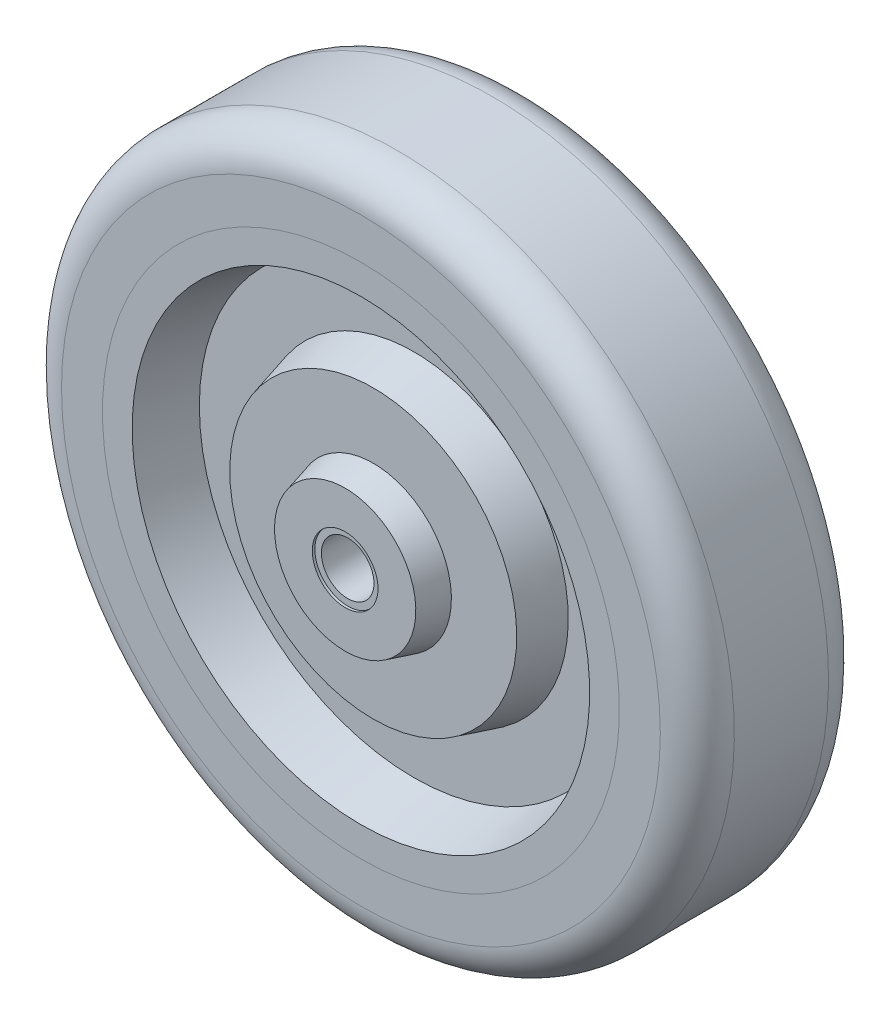
ISO-10303-21;
HEADER;
FILE_DESCRIPTION(('STEP AP214'),'2;1');
FILE_NAME('part.step','',(''),(''),'','','');
FILE_SCHEMA(('AUTOMOTIVE_DESIGN { 1 0 10303 214 1 1 1 1 }'));
ENDSEC;
DATA;
#1=APPLICATION_CONTEXT('core data for automotive mechanical design processes');
#2=APPLICATION_PROTOCOL_DEFINITION('international standard','automotive_design',2000,#1);
#3=PRODUCT_CONTEXT('',#1,'mechanical');
#4=PRODUCT('Part','Part','',(#3));
#5=PRODUCT_RELATED_PRODUCT_CATEGORY('part','',(#4));
#6=PRODUCT_DEFINITION_FORMATION('','',#4);
#7=PRODUCT_DEFINITION_CONTEXT('part definition',#1,'design');
#8=PRODUCT_DEFINITION('design','',#6,#7);
#9=PRODUCT_DEFINITION_SHAPE('','',#8);
#10=(LENGTH_UNIT() NAMED_UNIT(*) SI_UNIT(.MILLI.,.METRE.));
#11=(NAMED_UNIT(*) PLANE_ANGLE_UNIT() SI_UNIT($,.RADIAN.));
#12=(NAMED_UNIT(*) SI_UNIT($,.STERADIAN.) SOLID_ANGLE_UNIT());
#13=UNCERTAINTY_MEASURE_WITH_UNIT(LENGTH_MEASURE(1.E-05),#10,'distance_accuracy_value','');
#14=(GEOMETRIC_REPRESENTATION_CONTEXT(3) GLOBAL_UNCERTAINTY_ASSIGNED_CONTEXT((#13)) GLOBAL_UNIT_ASSIGNED_CONTEXT((#10,
#11,#12)) REPRESENTATION_CONTEXT('',''));
#15=CARTESIAN_POINT('',(0.,0.,0.));
#16=DIRECTION('',(0.,0.,1.));
#17=DIRECTION('',(1.,0.,0.));
#18=AXIS2_PLACEMENT_3D('',#15,#16,#17);
#19=CARTESIAN_POINT('',(0.,0.,15.08125));
#20=DIRECTION('',(0.,0.,1.));
#21=DIRECTION('',(0.,-1.,0.));
#22=AXIS2_PLACEMENT_3D('',#19,#20,#21);
#23=CYLINDRICAL_SURFACE('',#22,3.96875);
#24=CARTESIAN_POINT('',(0.,0.,14.70025));
#25=DIRECTION('',(0.,0.,1.));
#26=DIRECTION('',(1.,0.,0.));
#27=AXIS2_PLACEMENT_3D('',#24,#25,#26);
#28=CIRCLE('',#27,3.96875);
#29=CARTESIAN_POINT('',(3.96875,0.,14.70025));
#30=VERTEX_POINT('',#29);
#31=EDGE_CURVE('E61',#30,#30,#28,.F.);
#32=ORIENTED_EDGE('',*,*,#31,.F.);
#33=EDGE_LOOP('',(#32));
#34=FACE_BOUND('',#33,.T.);
#35=CARTESIAN_POINT('',(0.,0.,-14.70025));
#36=DIRECTION('',(0.,0.,-1.));
#37=DIRECTION('',(-1.,0.,0.));
#38=AXIS2_PLACEMENT_3D('',#35,#36,#37);
#39=CIRCLE('',#38,3.96875);
#40=CARTESIAN_POINT('',(-3.96875,0.,-14.70025));
#41=VERTEX_POINT('',#40);
#42=EDGE_CURVE('E49',#41,#41,#39,.F.);
#43=ORIENTED_EDGE('',*,*,#42,.F.);
#44=EDGE_LOOP('',(#43));
#45=FACE_BOUND('',#44,.T.);
#46=ADVANCED_FACE('F45',(#34,#45),#23,.F.);
#47=CARTESIAN_POINT('',(0.,39.0271,12.7));
#48=DIRECTION('',(0.,0.,-1.));
#49=DIRECTION('',(0.,1.,0.));
#50=AXIS2_PLACEMENT_3D('',#47,#48,#49);
#51=PLANE('',#50);
#52=CARTESIAN_POINT('',(0.,0.,12.7));
#53=DIRECTION('',(0.,0.,1.));
#54=DIRECTION('',(0.,-1.,0.));
#55=AXIS2_PLACEMENT_3D('',#52,#53,#54);
#56=CIRCLE('',#55,34.544);
#57=CARTESIAN_POINT('',(0.,-34.544,12.7));
#58=VERTEX_POINT('',#57);
#59=EDGE_CURVE('E63',#58,#58,#56,.T.);
#60=ORIENTED_EDGE('',*,*,#59,.F.);
#61=EDGE_LOOP('',(#60));
#62=FACE_BOUND('',#61,.T.);
#63=CARTESIAN_POINT('',(0.,0.,12.7));
#64=DIRECTION('',(0.,0.,1.));
#65=DIRECTION('',(0.,-1.,0.));
#66=AXIS2_PLACEMENT_3D('',#63,#64,#65);
#67=CIRCLE('',#66,39.0271);
#68=CARTESIAN_POINT('',(0.,-39.0271,12.7));
#69=VERTEX_POINT('',#68);
#70=EDGE_CURVE('E11',#69,#69,#67,.T.);
#71=ORIENTED_EDGE('',*,*,#70,.T.);
#72=EDGE_LOOP('',(#71));
#73=FACE_BOUND('',#72,.T.);
#74=ADVANCED_FACE('F47',(#62,#73),#51,.F.);
#75=CARTESIAN_POINT('',(0.,0.,15.08125));
#76=DIRECTION('',(0.,0.,1.));
#77=DIRECTION('',(0.,-1.,0.));
#78=AXIS2_PLACEMENT_3D('',#75,#76,#77);
#79=CYLINDRICAL_SURFACE('',#78,39.0271);
#80=ORIENTED_EDGE('',*,*,#70,.F.);
#81=EDGE_LOOP('',(#80));
#82=FACE_BOUND('',#81,.T.);
#83=CARTESIAN_POINT('',(0.,0.,-12.7));
#84=DIRECTION('',(0.,0.,1.));
#85=DIRECTION('',(0.,-1.,0.));
#86=AXIS2_PLACEMENT_3D('',#83,#84,#85);
#87=CIRCLE('',#86,39.0271);
#88=CARTESIAN_POINT('',(0.,-39.0271,-12.7));
#89=VERTEX_POINT('',#88);
#90=EDGE_CURVE('E53',#89,#89,#87,.T.);
#91=ORIENTED_EDGE('',*,*,#90,.T.);
#92=EDGE_LOOP('',(#91));
#93=FACE_BOUND('',#92,.T.);
#94=ADVANCED_FACE('F164',(#82,#93),#79,.T.);
#95=CARTESIAN_POINT('',(0.,39.0271,-12.7));
#96=DIRECTION('',(0.,0.,1.));
#97=DIRECTION('',(0.,-1.,0.));
#98=AXIS2_PLACEMENT_3D('',#95,#96,#97);
#99=PLANE('',#98);
#100=ORIENTED_EDGE('',*,*,#90,.F.);
#101=EDGE_LOOP('',(#100));
#102=FACE_BOUND('',#101,.T.);
#103=CARTESIAN_POINT('',(0.,0.,-12.7));
#104=DIRECTION('',(0.,0.,1.));
#105=DIRECTION('',(0.,-1.,0.));
#106=AXIS2_PLACEMENT_3D('',#103,#104,#105);
#107=CIRCLE('',#106,34.544);
#108=CARTESIAN_POINT('',(0.,-34.544,-12.7));
#109=VERTEX_POINT('',#108);
#110=EDGE_CURVE('E58',#109,#109,#107,.T.);
#111=ORIENTED_EDGE('',*,*,#110,.T.);
#112=EDGE_LOOP('',(#111));
#113=FACE_BOUND('',#112,.T.);
#114=ADVANCED_FACE('F112',(#102,#113),#99,.F.);
#115=CARTESIAN_POINT('',(0.,0.,-4.699));
#116=DIRECTION('',(0.,0.,-1.));
#117=DIRECTION('',(0.,1.,0.));
#118=AXIS2_PLACEMENT_3D('',#115,#116,#117);
#119=CONICAL_SURFACE('',#118,32.4001385113586,0.261799387799143);
#120=ORIENTED_EDGE('',*,*,#110,.F.);
#121=EDGE_LOOP('',(#120));
#122=FACE_BOUND('',#121,.T.);
#123=CARTESIAN_POINT('',(0.,0.,-4.699));
#124=DIRECTION('',(0.,0.,1.));
#125=DIRECTION('',(0.,-1.,0.));
#126=AXIS2_PLACEMENT_3D('',#123,#124,#125);
#127=CIRCLE('',#126,32.4001385113586);
#128=CARTESIAN_POINT('',(0.,-32.4001385113586,-4.69900000000001));
#129=VERTEX_POINT('',#128);
#130=EDGE_CURVE('E107',#129,#129,#127,.T.);
#131=ORIENTED_EDGE('',*,*,#130,.T.);
#132=EDGE_LOOP('',(#131));
#133=FACE_BOUND('',#132,.T.);
#134=ADVANCED_FACE('F114',(#122,#133),#119,.F.);
#135=CARTESIAN_POINT('',(0.,32.4001385113586,-4.699));
#136=DIRECTION('',(0.,0.,1.));
#137=DIRECTION('',(0.,-1.,0.));
#138=AXIS2_PLACEMENT_3D('',#135,#136,#137);
#139=PLANE('',#138);
#140=ORIENTED_EDGE('',*,*,#130,.F.);
#141=EDGE_LOOP('',(#140));
#142=FACE_BOUND('',#141,.T.);
#143=CARTESIAN_POINT('',(0.,0.,-4.699));
#144=DIRECTION('',(0.,0.,1.));
#145=DIRECTION('',(0.,-1.,0.));
#146=AXIS2_PLACEMENT_3D('',#143,#144,#145);
#147=CIRCLE('',#146,23.3115286186636);
#148=CARTESIAN_POINT('',(0.,-23.3115286186636,-4.69900000000001));
#149=VERTEX_POINT('',#148);
#150=EDGE_CURVE('E104',#149,#149,#147,.T.);
#151=ORIENTED_EDGE('',*,*,#150,.T.);
#152=EDGE_LOOP('',(#151));
#153=FACE_BOUND('',#152,.T.);
#154=ADVANCED_FACE('F117',(#142,#153),#139,.F.);
#155=CARTESIAN_POINT('',(0.,0.,-10.83945));
#156=DIRECTION('',(0.,0.,1.));
#157=DIRECTION('',(0.,-1.,0.));
#158=AXIS2_PLACEMENT_3D('',#155,#156,#157);
#159=CONICAL_SURFACE('',#158,21.6662,0.261799387799143);
#160=ORIENTED_EDGE('',*,*,#150,.F.);
#161=EDGE_LOOP('',(#160));
#162=FACE_BOUND('',#161,.T.);
#163=CARTESIAN_POINT('',(0.,0.,-10.83945));
#164=DIRECTION('',(0.,0.,1.));
#165=DIRECTION('',(0.,-1.,0.));
#166=AXIS2_PLACEMENT_3D('',#163,#164,#165);
#167=CIRCLE('',#166,21.6662);
#168=CARTESIAN_POINT('',(0.,-21.6662,-10.83945));
#169=VERTEX_POINT('',#168);
#170=EDGE_CURVE('E101',#169,#169,#167,.T.);
#171=ORIENTED_EDGE('',*,*,#170,.T.);
#172=EDGE_LOOP('',(#171));
#173=FACE_BOUND('',#172,.T.);
#174=ADVANCED_FACE('F123',(#162,#173),#159,.T.);
#175=CARTESIAN_POINT('',(0.,21.6662,-10.83945));
#176=DIRECTION('',(0.,0.,1.));
#177=DIRECTION('',(0.,-1.,0.));
#178=AXIS2_PLACEMENT_3D('',#175,#176,#177);
#179=PLANE('',#178);
#180=ORIENTED_EDGE('',*,*,#170,.F.);
#181=EDGE_LOOP('',(#180));
#182=FACE_BOUND('',#181,.T.);
#183=CARTESIAN_POINT('',(0.,0.,-10.83945));
#184=DIRECTION('',(0.,0.,1.));
#185=DIRECTION('',(0.,-1.,0.));
#186=AXIS2_PLACEMENT_3D('',#183,#184,#185);
#187=CIRCLE('',#186,11.8045868844543);
#188=CARTESIAN_POINT('',(0.,-11.8045868844543,-10.83945));
#189=VERTEX_POINT('',#188);
#190=EDGE_CURVE('E98',#189,#189,#187,.T.);
#191=ORIENTED_EDGE('',*,*,#190,.T.);
#192=EDGE_LOOP('',(#191));
#193=FACE_BOUND('',#192,.T.);
#194=ADVANCED_FACE('F129',(#182,#193),#179,.F.);
#195=CARTESIAN_POINT('',(0.,0.,-15.08125));
#196=DIRECTION('',(0.,0.,1.));
#197=DIRECTION('',(0.,-1.,0.));
#198=AXIS2_PLACEMENT_3D('',#195,#196,#197);
#199=CONICAL_SURFACE('',#198,10.668,0.261799387799143);
#200=ORIENTED_EDGE('',*,*,#190,.F.);
#201=EDGE_LOOP('',(#200));
#202=FACE_BOUND('',#201,.T.);
#203=CARTESIAN_POINT('',(0.,0.,-15.08125));
#204=DIRECTION('',(0.,0.,1.));
#205=DIRECTION('',(0.,-1.,0.));
#206=AXIS2_PLACEMENT_3D('',#203,#204,#205);
#207=CIRCLE('',#206,10.668);
#208=CARTESIAN_POINT('',(0.,-10.668,-15.08125));
#209=VERTEX_POINT('',#208);
#210=EDGE_CURVE('E95',#209,#209,#207,.T.);
#211=ORIENTED_EDGE('',*,*,#210,.T.);
#212=EDGE_LOOP('',(#211));
#213=FACE_BOUND('',#212,.T.);
#214=ADVANCED_FACE('F135',(#202,#213),#199,.T.);
#215=CARTESIAN_POINT('',(0.,10.668,-15.08125));
#216=DIRECTION('',(0.,0.,1.));
#217=DIRECTION('',(0.,-1.,0.));
#218=AXIS2_PLACEMENT_3D('',#215,#216,#217);
#219=PLANE('',#218);
#220=CARTESIAN_POINT('',(0.,0.,-15.08125));
#221=DIRECTION('',(0.,0.,1.));
#222=DIRECTION('',(1.,0.,0.));
#223=AXIS2_PLACEMENT_3D('',#220,#221,#222);
#224=CIRCLE('',#223,4.9609375);
#225=CARTESIAN_POINT('',(-4.9609375,0.,-15.08125));
#226=VERTEX_POINT('',#225);
#227=EDGE_CURVE('E78',#226,#226,#224,.T.);
#228=ORIENTED_EDGE('',*,*,#227,.T.);
#229=EDGE_LOOP('',(#228));
#230=FACE_BOUND('',#229,.T.);
#231=ORIENTED_EDGE('',*,*,#210,.F.);
#232=EDGE_LOOP('',(#231));
#233=FACE_BOUND('',#232,.T.);
#234=ADVANCED_FACE('F141',(#230,#233),#219,.F.);
#235=CARTESIAN_POINT('',(0.,10.668,15.08125));
#236=DIRECTION('',(0.,0.,-1.));
#237=DIRECTION('',(0.,1.,0.));
#238=AXIS2_PLACEMENT_3D('',#235,#236,#237);
#239=PLANE('',#238);
#240=CARTESIAN_POINT('',(0.,0.,15.08125));
#241=DIRECTION('',(0.,0.,1.));
#242=DIRECTION('',(1.,0.,0.));
#243=AXIS2_PLACEMENT_3D('',#240,#241,#242);
#244=CIRCLE('',#243,4.9609375);
#245=CARTESIAN_POINT('',(4.9609375,0.,15.08125));
#246=VERTEX_POINT('',#245);
#247=EDGE_CURVE('E71',#246,#246,#244,.T.);
#248=ORIENTED_EDGE('',*,*,#247,.F.);
#249=EDGE_LOOP('',(#248));
#250=FACE_BOUND('',#249,.T.);
#251=CARTESIAN_POINT('',(0.,0.,15.08125));
#252=DIRECTION('',(0.,0.,1.));
#253=DIRECTION('',(0.,-1.,0.));
#254=AXIS2_PLACEMENT_3D('',#251,#252,#253);
#255=CIRCLE('',#254,10.668);
#256=CARTESIAN_POINT('',(0.,-10.668,15.08125));
#257=VERTEX_POINT('',#256);
#258=EDGE_CURVE('E92',#257,#257,#255,.T.);
#259=ORIENTED_EDGE('',*,*,#258,.T.);
#260=EDGE_LOOP('',(#259));
#261=FACE_BOUND('',#260,.T.);
#262=ADVANCED_FACE('F146',(#250,#261),#239,.F.);
#263=CARTESIAN_POINT('',(0.,0.,10.83945));
#264=DIRECTION('',(0.,0.,-1.));
#265=DIRECTION('',(0.,1.,0.));
#266=AXIS2_PLACEMENT_3D('',#263,#264,#265);
#267=CONICAL_SURFACE('',#266,11.8045868844543,0.261799387799143);
#268=ORIENTED_EDGE('',*,*,#258,.F.);
#269=EDGE_LOOP('',(#268));
#270=FACE_BOUND('',#269,.T.);
#271=CARTESIAN_POINT('',(0.,0.,10.83945));
#272=DIRECTION('',(0.,0.,1.));
#273=DIRECTION('',(0.,-1.,0.));
#274=AXIS2_PLACEMENT_3D('',#271,#272,#273);
#275=CIRCLE('',#274,11.8045868844543);
#276=CARTESIAN_POINT('',(0.,-11.8045868844543,10.83945));
#277=VERTEX_POINT('',#276);
#278=EDGE_CURVE('E89',#277,#277,#275,.T.);
#279=ORIENTED_EDGE('',*,*,#278,.T.);
#280=EDGE_LOOP('',(#279));
#281=FACE_BOUND('',#280,.T.);
#282=ADVANCED_FACE('F154',(#270,#281),#267,.T.);
#283=CARTESIAN_POINT('',(0.,21.6662,10.83945));
#284=DIRECTION('',(0.,0.,-1.));
#285=DIRECTION('',(0.,1.,0.));
#286=AXIS2_PLACEMENT_3D('',#283,#284,#285);
#287=PLANE('',#286);
#288=ORIENTED_EDGE('',*,*,#278,.F.);
#289=EDGE_LOOP('',(#288));
#290=FACE_BOUND('',#289,.T.);
#291=CARTESIAN_POINT('',(0.,0.,10.83945));
#292=DIRECTION('',(0.,0.,1.));
#293=DIRECTION('',(0.,-1.,0.));
#294=AXIS2_PLACEMENT_3D('',#291,#292,#293);
#295=CIRCLE('',#294,21.6662);
#296=CARTESIAN_POINT('',(0.,-21.6662,10.83945));
#297=VERTEX_POINT('',#296);
#298=EDGE_CURVE('E86',#297,#297,#295,.T.);
#299=ORIENTED_EDGE('',*,*,#298,.T.);
#300=EDGE_LOOP('',(#299));
#301=FACE_BOUND('',#300,.T.);
#302=ADVANCED_FACE('F170',(#290,#301),#287,.F.);
#303=CARTESIAN_POINT('',(0.,0.,4.69899999999999));
#304=DIRECTION('',(0.,0.,-1.));
#305=DIRECTION('',(0.,1.,0.));
#306=AXIS2_PLACEMENT_3D('',#303,#304,#305);
#307=CONICAL_SURFACE('',#306,23.3115286186636,0.261799387799142);
#308=ORIENTED_EDGE('',*,*,#298,.F.);
#309=EDGE_LOOP('',(#308));
#310=FACE_BOUND('',#309,.T.);
#311=CARTESIAN_POINT('',(0.,0.,4.69899999999999));
#312=DIRECTION('',(0.,0.,1.));
#313=DIRECTION('',(0.,-1.,0.));
#314=AXIS2_PLACEMENT_3D('',#311,#312,#313);
#315=CIRCLE('',#314,23.3115286186636);
#316=CARTESIAN_POINT('',(0.,-23.3115286186636,4.69899999999999));
#317=VERTEX_POINT('',#316);
#318=EDGE_CURVE('E83',#317,#317,#315,.T.);
#319=ORIENTED_EDGE('',*,*,#318,.T.);
#320=EDGE_LOOP('',(#319));
#321=FACE_BOUND('',#320,.T.);
#322=ADVANCED_FACE('F174',(#310,#321),#307,.T.);
#323=CARTESIAN_POINT('',(0.,32.4001385113586,4.699));
#324=DIRECTION('',(0.,0.,-1.));
#325=DIRECTION('',(0.,1.,0.));
#326=AXIS2_PLACEMENT_3D('',#323,#324,#325);
#327=PLANE('',#326);
#328=ORIENTED_EDGE('',*,*,#318,.F.);
#329=EDGE_LOOP('',(#328));
#330=FACE_BOUND('',#329,.T.);
#331=CARTESIAN_POINT('',(0.,0.,4.69899999999999));
#332=DIRECTION('',(0.,0.,1.));
#333=DIRECTION('',(0.,-1.,0.));
#334=AXIS2_PLACEMENT_3D('',#331,#332,#333);
#335=CIRCLE('',#334,32.4001385113586);
#336=CARTESIAN_POINT('',(0.,-32.4001385113586,4.69899999999999));
#337=VERTEX_POINT('',#336);
#338=EDGE_CURVE('E68',#337,#337,#335,.T.);
#339=ORIENTED_EDGE('',*,*,#338,.T.);
#340=EDGE_LOOP('',(#339));
#341=FACE_BOUND('',#340,.T.);
#342=ADVANCED_FACE('F178',(#330,#341),#327,.F.);
#343=CARTESIAN_POINT('',(0.,0.,12.7));
#344=DIRECTION('',(0.,0.,1.));
#345=DIRECTION('',(0.,-1.,0.));
#346=AXIS2_PLACEMENT_3D('',#343,#344,#345);
#347=CONICAL_SURFACE('',#346,34.544,0.261799387799143);
#348=ORIENTED_EDGE('',*,*,#338,.F.);
#349=EDGE_LOOP('',(#348));
#350=FACE_BOUND('',#349,.T.);
#351=ORIENTED_EDGE('',*,*,#59,.T.);
#352=EDGE_LOOP('',(#351));
#353=FACE_BOUND('',#352,.T.);
#354=ADVANCED_FACE('F182',(#350,#353),#347,.F.);
#355=CARTESIAN_POINT('',(0.,0.,14.70025));
#356=DIRECTION('',(0.,0.,1.));
#357=DIRECTION('',(1.,0.,0.));
#358=AXIS2_PLACEMENT_3D('',#355,#356,#357);
#359=PLANE('',#358);
#360=CARTESIAN_POINT('',(0.,0.,14.70025));
#361=DIRECTION('',(0.,0.,1.));
#362=DIRECTION('',(1.,0.,0.));
#363=AXIS2_PLACEMENT_3D('',#360,#361,#362);
#364=CIRCLE('',#363,4.9609375);
#365=CARTESIAN_POINT('',(4.9609375,0.,14.70025));
#366=VERTEX_POINT('',#365);
#367=EDGE_CURVE('E64',#366,#366,#364,.T.);
#368=ORIENTED_EDGE('',*,*,#367,.T.);
#369=EDGE_LOOP('',(#368));
#370=FACE_BOUND('',#369,.T.);
#371=ORIENTED_EDGE('',*,*,#31,.T.);
#372=EDGE_LOOP('',(#371));
#373=FACE_BOUND('',#372,.T.);
#374=ADVANCED_FACE('F186',(#370,#373),#359,.T.);
#375=CARTESIAN_POINT('',(0.,0.,14.70025));
#376=DIRECTION('',(0.,0.,1.));
#377=DIRECTION('',(1.,0.,0.));
#378=AXIS2_PLACEMENT_3D('',#375,#376,#377);
#379=CYLINDRICAL_SURFACE('',#378,4.9609375);
#380=CARTESIAN_POINT('',(4.9609375,0.,14.70025));
#381=CARTESIAN_POINT('',(4.9609375,0.,14.70421875));
#382=CARTESIAN_POINT('',(4.9609375,0.,14.7081875));
#383=CARTESIAN_POINT('',(4.9609375,0.,14.716125));
#384=CARTESIAN_POINT('',(4.9609375,0.,14.72009375));
#385=CARTESIAN_POINT('',(4.9609375,0.,14.72803125));
#386=CARTESIAN_POINT('',(4.9609375,0.,14.732));
#387=CARTESIAN_POINT('',(4.9609375,0.,14.7399375));
#388=CARTESIAN_POINT('',(4.9609375,0.,14.74390625));
#389=CARTESIAN_POINT('',(4.9609375,0.,14.75184375));
#390=CARTESIAN_POINT('',(4.9609375,0.,14.7558125));
#391=CARTESIAN_POINT('',(4.9609375,0.,14.76375));
#392=CARTESIAN_POINT('',(4.9609375,0.,14.76771875));
#393=CARTESIAN_POINT('',(4.9609375,0.,14.77565625));
#394=CARTESIAN_POINT('',(4.9609375,0.,14.779625));
#395=CARTESIAN_POINT('',(4.9609375,0.,14.7875625));
#396=CARTESIAN_POINT('',(4.9609375,0.,14.79153125));
#397=CARTESIAN_POINT('',(4.9609375,0.,14.79946875));
#398=CARTESIAN_POINT('',(4.9609375,0.,14.8034375));
#399=CARTESIAN_POINT('',(4.9609375,0.,14.811375));
#400=CARTESIAN_POINT('',(4.9609375,0.,14.81534375));
#401=CARTESIAN_POINT('',(4.9609375,0.,14.82328125));
#402=CARTESIAN_POINT('',(4.9609375,0.,14.82725));
#403=CARTESIAN_POINT('',(4.9609375,0.,14.8351875));
#404=CARTESIAN_POINT('',(4.9609375,0.,14.83915625));
#405=CARTESIAN_POINT('',(4.9609375,0.,14.84709375));
#406=CARTESIAN_POINT('',(4.9609375,0.,14.8510625));
#407=CARTESIAN_POINT('',(4.9609375,0.,14.859));
#408=CARTESIAN_POINT('',(4.9609375,0.,14.86296875));
#409=CARTESIAN_POINT('',(4.9609375,0.,14.87090625));
#410=CARTESIAN_POINT('',(4.9609375,0.,14.874875));
#411=CARTESIAN_POINT('',(4.9609375,0.,14.8828125));
#412=CARTESIAN_POINT('',(4.9609375,0.,14.88678125));
#413=CARTESIAN_POINT('',(4.9609375,0.,14.89471875));
#414=CARTESIAN_POINT('',(4.9609375,0.,14.8986875));
#415=CARTESIAN_POINT('',(4.9609375,0.,14.906625));
#416=CARTESIAN_POINT('',(4.9609375,0.,14.91059375));
#417=CARTESIAN_POINT('',(4.9609375,0.,14.91853125));
#418=CARTESIAN_POINT('',(4.9609375,0.,14.9225));
#419=CARTESIAN_POINT('',(4.9609375,0.,14.9304375));
#420=CARTESIAN_POINT('',(4.9609375,0.,14.93440625));
#421=CARTESIAN_POINT('',(4.9609375,0.,14.94234375));
#422=CARTESIAN_POINT('',(4.9609375,0.,14.9463125));
#423=CARTESIAN_POINT('',(4.9609375,0.,14.95425));
#424=CARTESIAN_POINT('',(4.9609375,0.,14.95821875));
#425=CARTESIAN_POINT('',(4.9609375,0.,14.96615625));
#426=CARTESIAN_POINT('',(4.9609375,0.,14.970125));
#427=CARTESIAN_POINT('',(4.9609375,0.,14.9780625));
#428=CARTESIAN_POINT('',(4.9609375,0.,14.98203125));
#429=CARTESIAN_POINT('',(4.9609375,0.,14.98996875));
#430=CARTESIAN_POINT('',(4.9609375,0.,14.9939375));
#431=CARTESIAN_POINT('',(4.9609375,0.,15.001875));
#432=CARTESIAN_POINT('',(4.9609375,0.,15.00584375));
#433=CARTESIAN_POINT('',(4.9609375,0.,15.01378125));
#434=CARTESIAN_POINT('',(4.9609375,0.,15.01775));
#435=CARTESIAN_POINT('',(4.9609375,0.,15.0256875));
#436=CARTESIAN_POINT('',(4.9609375,0.,15.02965625));
#437=CARTESIAN_POINT('',(4.9609375,0.,15.03759375));
#438=CARTESIAN_POINT('',(4.9609375,0.,15.0415625));
#439=CARTESIAN_POINT('',(4.9609375,0.,15.0495));
#440=CARTESIAN_POINT('',(4.9609375,0.,15.05346875));
#441=CARTESIAN_POINT('',(4.9609375,0.,15.06140625));
#442=CARTESIAN_POINT('',(4.9609375,0.,15.065375));
#443=CARTESIAN_POINT('',(4.9609375,0.,15.0733125));
#444=CARTESIAN_POINT('',(4.9609375,0.,15.07728125));
#445=CARTESIAN_POINT('',(4.9609375,0.,15.08125));
#446=B_SPLINE_CURVE_WITH_KNOTS('',3,(#380,#381,#382,#383,#384,#385,#386,#387,#388,#389,#390,
#391,#392,#393,#394,#395,#396,#397,#398,#399,#400,#401,#402,#403,#404,#405,#406,#407,#408,#409,
#410,#411,#412,#413,#414,#415,#416,#417,#418,#419,#420,#421,#422,#423,#424,#425,#426,#427,#428,
#429,#430,#431,#432,#433,#434,#435,#436,#437,#438,#439,#440,#441,#442,#443,#444,#445),
.UNSPECIFIED.,.F.,.F.,(4,2,2,2,2,2,2,2,2,2,2,2,2,2,2,2,2,2,2,2,2,2,2,2,2,2,2,2,2,2,2,2,4),(0.,
0.0119062500000006,0.0238125000000013,0.0357187500000002,0.0476250000000008,0.0595312500000014,
0.0714375000000003,0.083343750000001,0.0952499999999998,0.10715625,0.119062500000001,0.13096875,
0.142875000000001,0.154781250000001,0.1666875,0.178593750000001,0.1905,0.20240625,
0.214312500000001,0.22621875,0.238125,0.250031250000001,0.2619375,0.273843750000001,0.28575,
0.29765625,0.309562500000001,0.32146875,0.333375,0.345281250000001,0.3571875,0.36909375,
0.380999999999999),.UNSPECIFIED.);
#447=EDGE_CURVE('BSEAM188',#366,#246,#446,.T.);
#448=ORIENTED_EDGE('',*,*,#367,.F.);
#449=ORIENTED_EDGE('',*,*,#247,.T.);
#450=ORIENTED_EDGE('',*,*,#447,.T.);
#451=ORIENTED_EDGE('',*,*,#447,.F.);
#452=EDGE_LOOP('',(#448,#450,#449,#451));
#453=FACE_BOUND('',#452,.T.);
#454=ADVANCED_FACE('F188',(#453),#379,.F.);
#455=CARTESIAN_POINT('',(0.,0.,-14.70025));
#456=DIRECTION('',(0.,0.,-1.));
#457=DIRECTION('',(1.,0.,0.));
#458=AXIS2_PLACEMENT_3D('',#455,#456,#457);
#459=PLANE('',#458);
#460=CARTESIAN_POINT('',(0.,0.,-14.70025));
#461=DIRECTION('',(0.,0.,1.));
#462=DIRECTION('',(1.,0.,0.));
#463=AXIS2_PLACEMENT_3D('',#460,#461,#462);
#464=CIRCLE('',#463,4.9609375);
#465=CARTESIAN_POINT('',(-4.9609375,0.,-14.70025));
#466=VERTEX_POINT('',#465);
#467=EDGE_CURVE('E204',#466,#466,#464,.T.);
#468=ORIENTED_EDGE('',*,*,#467,.F.);
#469=EDGE_LOOP('',(#468));
#470=FACE_BOUND('',#469,.T.);
#471=ORIENTED_EDGE('',*,*,#42,.T.);
#472=EDGE_LOOP('',(#471));
#473=FACE_BOUND('',#472,.T.);
#474=ADVANCED_FACE('F190',(#470,#473),#459,.T.);
#475=CARTESIAN_POINT('',(0.,0.,-14.70025));
#476=DIRECTION('',(0.,0.,-1.));
#477=DIRECTION('',(-1.,0.,0.));
#478=AXIS2_PLACEMENT_3D('',#475,#476,#477);
#479=CYLINDRICAL_SURFACE('',#478,4.9609375);
#480=CARTESIAN_POINT('',(-4.9609375,0.,-14.70025));
#481=CARTESIAN_POINT('',(-4.9609375,0.,-14.70421875));
#482=CARTESIAN_POINT('',(-4.9609375,0.,-14.7081875));
#483=CARTESIAN_POINT('',(-4.9609375,0.,-14.716125));
#484=CARTESIAN_POINT('',(-4.9609375,0.,-14.72009375));
#485=CARTESIAN_POINT('',(-4.9609375,0.,-14.72803125));
#486=CARTESIAN_POINT('',(-4.9609375,0.,-14.732));
#487=CARTESIAN_POINT('',(-4.9609375,0.,-14.7399375));
#488=CARTESIAN_POINT('',(-4.9609375,0.,-14.74390625));
#489=CARTESIAN_POINT('',(-4.9609375,0.,-14.75184375));
#490=CARTESIAN_POINT('',(-4.9609375,0.,-14.7558125));
#491=CARTESIAN_POINT('',(-4.9609375,0.,-14.76375));
#492=CARTESIAN_POINT('',(-4.9609375,0.,-14.76771875));
#493=CARTESIAN_POINT('',(-4.9609375,0.,-14.77565625));
#494=CARTESIAN_POINT('',(-4.9609375,0.,-14.779625));
#495=CARTESIAN_POINT('',(-4.9609375,0.,-14.7875625));
#496=CARTESIAN_POINT('',(-4.9609375,0.,-14.79153125));
#497=CARTESIAN_POINT('',(-4.9609375,0.,-14.79946875));
#498=CARTESIAN_POINT('',(-4.9609375,0.,-14.8034375));
#499=CARTESIAN_POINT('',(-4.9609375,0.,-14.811375));
#500=CARTESIAN_POINT('',(-4.9609375,0.,-14.81534375));
#501=CARTESIAN_POINT('',(-4.9609375,0.,-14.82328125));
#502=CARTESIAN_POINT('',(-4.9609375,0.,-14.82725));
#503=CARTESIAN_POINT('',(-4.9609375,0.,-14.8351875));
#504=CARTESIAN_POINT('',(-4.9609375,0.,-14.83915625));
#505=CARTESIAN_POINT('',(-4.9609375,0.,-14.84709375));
#506=CARTESIAN_POINT('',(-4.9609375,0.,-14.8510625));
#507=CARTESIAN_POINT('',(-4.9609375,0.,-14.859));
#508=CARTESIAN_POINT('',(-4.9609375,0.,-14.86296875));
#509=CARTESIAN_POINT('',(-4.9609375,0.,-14.87090625));
#510=CARTESIAN_POINT('',(-4.9609375,0.,-14.874875));
#511=CARTESIAN_POINT('',(-4.9609375,0.,-14.8828125));
#512=CARTESIAN_POINT('',(-4.9609375,0.,-14.88678125));
#513=CARTESIAN_POINT('',(-4.9609375,0.,-14.89471875));
#514=CARTESIAN_POINT('',(-4.9609375,0.,-14.8986875));
#515=CARTESIAN_POINT('',(-4.9609375,0.,-14.906625));
#516=CARTESIAN_POINT('',(-4.9609375,0.,-14.91059375));
#517=CARTESIAN_POINT('',(-4.9609375,0.,-14.91853125));
#518=CARTESIAN_POINT('',(-4.9609375,0.,-14.9225));
#519=CARTESIAN_POINT('',(-4.9609375,0.,-14.9304375));
#520=CARTESIAN_POINT('',(-4.9609375,0.,-14.93440625));
#521=CARTESIAN_POINT('',(-4.9609375,0.,-14.94234375));
#522=CARTESIAN_POINT('',(-4.9609375,0.,-14.9463125));
#523=CARTESIAN_POINT('',(-4.9609375,0.,-14.95425));
#524=CARTESIAN_POINT('',(-4.9609375,0.,-14.95821875));
#525=CARTESIAN_POINT('',(-4.9609375,0.,-14.96615625));
#526=CARTESIAN_POINT('',(-4.9609375,0.,-14.970125));
#527=CARTESIAN_POINT('',(-4.9609375,0.,-14.9780625));
#528=CARTESIAN_POINT('',(-4.9609375,0.,-14.98203125));
#529=CARTESIAN_POINT('',(-4.9609375,0.,-14.98996875));
#530=CARTESIAN_POINT('',(-4.9609375,0.,-14.9939375));
#531=CARTESIAN_POINT('',(-4.9609375,0.,-15.001875));
#532=CARTESIAN_POINT('',(-4.9609375,0.,-15.00584375));
#533=CARTESIAN_POINT('',(-4.9609375,0.,-15.01378125));
#534=CARTESIAN_POINT('',(-4.9609375,0.,-15.01775));
#535=CARTESIAN_POINT('',(-4.9609375,0.,-15.0256875));
#536=CARTESIAN_POINT('',(-4.9609375,0.,-15.02965625));
#537=CARTESIAN_POINT('',(-4.9609375,0.,-15.03759375));
#538=CARTESIAN_POINT('',(-4.9609375,0.,-15.0415625));
#539=CARTESIAN_POINT('',(-4.9609375,0.,-15.0495));
#540=CARTESIAN_POINT('',(-4.9609375,0.,-15.05346875));
#541=CARTESIAN_POINT('',(-4.9609375,0.,-15.06140625));
#542=CARTESIAN_POINT('',(-4.9609375,0.,-15.065375));
#543=CARTESIAN_POINT('',(-4.9609375,0.,-15.0733125));
#544=CARTESIAN_POINT('',(-4.9609375,0.,-15.07728125));
#545=CARTESIAN_POINT('',(-4.9609375,0.,-15.08125));
#546=B_SPLINE_CURVE_WITH_KNOTS('',3,(#480,#481,#482,#483,#484,#485,#486,#487,#488,#489,#490,
#491,#492,#493,#494,#495,#496,#497,#498,#499,#500,#501,#502,#503,#504,#505,#506,#507,#508,#509,
#510,#511,#512,#513,#514,#515,#516,#517,#518,#519,#520,#521,#522,#523,#524,#525,#526,#527,#528,
#529,#530,#531,#532,#533,#534,#535,#536,#537,#538,#539,#540,#541,#542,#543,#544,#545),
.UNSPECIFIED.,.F.,.F.,(4,2,2,2,2,2,2,2,2,2,2,2,2,2,2,2,2,2,2,2,2,2,2,2,2,2,2,2,2,2,2,2,4),(0.,
0.0119062499999989,0.0238124999999995,0.0357187499999984,0.0476249999999991,0.0595312499999997,
0.0714374999999986,0.0833437499999992,0.0952499999999998,0.107156249999999,0.119062499999999,
0.130968749999998,0.142874999999999,0.15478125,0.166687499999998,0.178593749999999,0.1905,
0.202406249999999,0.214312499999999,0.226218749999998,0.238124999999999,0.250031249999999,
0.261937499999998,0.273843749999999,0.28575,0.297656249999998,0.309562499999999,
0.321468749999998,0.333374999999999,0.345281249999999,0.357187499999998,0.369093749999999,
0.380999999999999),.UNSPECIFIED.);
#547=EDGE_CURVE('BSEAM194',#466,#226,#546,.T.);
#548=ORIENTED_EDGE('',*,*,#467,.T.);
#549=ORIENTED_EDGE('',*,*,#227,.F.);
#550=ORIENTED_EDGE('',*,*,#547,.T.);
#551=ORIENTED_EDGE('',*,*,#547,.F.);
#552=EDGE_LOOP('',(#548,#550,#549,#551));
#553=FACE_BOUND('',#552,.T.);
#554=ADVANCED_FACE('F194',(#553),#479,.F.);
#555=CLOSED_SHELL('',(#46,#74,#94,#114,#134,#154,#174,#194,#214,#234,#262,#282,#302,#322,#342,
#354,#374,#454,#474,#554));
#556=MANIFOLD_SOLID_BREP('B2',#555);
#557=CARTESIAN_POINT('',(0.,0.,7.11199999999999));
#558=DIRECTION('',(0.,0.,1.));
#559=DIRECTION('',(0.,-1.,0.));
#560=AXIS2_PLACEMENT_3D('',#557,#558,#559);
#561=TOROIDAL_SURFACE('',#560,45.212,5.588);
#562=CARTESIAN_POINT('',(0.,0.,12.7));
#563=DIRECTION('',(0.,0.,1.));
#564=DIRECTION('',(0.,-1.,0.));
#565=AXIS2_PLACEMENT_3D('',#562,#563,#564);
#566=CIRCLE('',#565,45.212);
#567=CARTESIAN_POINT('',(0.,-45.212,12.7));
#568=VERTEX_POINT('',#567);
#569=EDGE_CURVE('E44',#568,#568,#566,.T.);
#570=ORIENTED_EDGE('',*,*,#569,.F.);
#571=EDGE_LOOP('',(#570));
#572=FACE_BOUND('',#571,.T.);
#573=CARTESIAN_POINT('',(0.,0.,7.11199999999999));
#574=DIRECTION('',(0.,0.,1.));
#575=DIRECTION('',(0.,-1.,0.));
#576=AXIS2_PLACEMENT_3D('',#573,#574,#575);
#577=CIRCLE('',#576,50.8);
#578=CARTESIAN_POINT('',(0.,-50.8,7.11199999999999));
#579=VERTEX_POINT('',#578);
#580=EDGE_CURVE('E329',#579,#579,#577,.T.);
#581=ORIENTED_EDGE('',*,*,#580,.T.);
#582=EDGE_LOOP('',(#581));
#583=FACE_BOUND('',#582,.T.);
#584=ADVANCED_FACE('F307',(#572,#583),#561,.T.);
#585=CARTESIAN_POINT('',(0.,45.212,12.7));
#586=DIRECTION('',(0.,0.,-1.));
#587=DIRECTION('',(0.,1.,0.));
#588=AXIS2_PLACEMENT_3D('',#585,#586,#587);
#589=PLANE('',#588);
#590=CARTESIAN_POINT('',(0.,0.,12.7));
#591=DIRECTION('',(0.,0.,1.));
#592=DIRECTION('',(0.,-1.,0.));
#593=AXIS2_PLACEMENT_3D('',#590,#591,#592);
#594=CIRCLE('',#593,39.0271);
#595=CARTESIAN_POINT('',(0.,-39.0271,12.7));
#596=VERTEX_POINT('',#595);
#597=EDGE_CURVE('E313',#596,#596,#594,.T.);
#598=ORIENTED_EDGE('',*,*,#597,.F.);
#599=EDGE_LOOP('',(#598));
#600=FACE_BOUND('',#599,.T.);
#601=ORIENTED_EDGE('',*,*,#569,.T.);
#602=EDGE_LOOP('',(#601));
#603=FACE_BOUND('',#602,.T.);
#604=ADVANCED_FACE('F354',(#600,#603),#589,.F.);
#605=CARTESIAN_POINT('',(0.,0.,15.08125));
#606=DIRECTION('',(0.,0.,1.));
#607=DIRECTION('',(0.,-1.,0.));
#608=AXIS2_PLACEMENT_3D('',#605,#606,#607);
#609=CYLINDRICAL_SURFACE('',#608,39.0271);
#610=CARTESIAN_POINT('',(0.,0.,-12.7));
#611=DIRECTION('',(0.,0.,1.));
#612=DIRECTION('',(0.,-1.,0.));
#613=AXIS2_PLACEMENT_3D('',#610,#611,#612);
#614=CIRCLE('',#613,39.0271);
#615=CARTESIAN_POINT('',(0.,-39.0271,-12.7));
#616=VERTEX_POINT('',#615);
#617=EDGE_CURVE('E317',#616,#616,#614,.T.);
#618=ORIENTED_EDGE('',*,*,#617,.F.);
#619=EDGE_LOOP('',(#618));
#620=FACE_BOUND('',#619,.T.);
#621=ORIENTED_EDGE('',*,*,#597,.T.);
#622=EDGE_LOOP('',(#621));
#623=FACE_BOUND('',#622,.T.);
#624=ADVANCED_FACE('F349',(#620,#623),#609,.F.);
#625=CARTESIAN_POINT('',(0.,45.212,-12.7));
#626=DIRECTION('',(0.,0.,1.));
#627=DIRECTION('',(0.,-1.,0.));
#628=AXIS2_PLACEMENT_3D('',#625,#626,#627);
#629=PLANE('',#628);
#630=CARTESIAN_POINT('',(0.,0.,-12.7));
#631=DIRECTION('',(0.,0.,1.));
#632=DIRECTION('',(0.,-1.,0.));
#633=AXIS2_PLACEMENT_3D('',#630,#631,#632);
#634=CIRCLE('',#633,45.212);
#635=CARTESIAN_POINT('',(0.,-45.212,-12.7));
#636=VERTEX_POINT('',#635);
#637=EDGE_CURVE('E321',#636,#636,#634,.T.);
#638=ORIENTED_EDGE('',*,*,#637,.F.);
#639=EDGE_LOOP('',(#638));
#640=FACE_BOUND('',#639,.T.);
#641=ORIENTED_EDGE('',*,*,#617,.T.);
#642=EDGE_LOOP('',(#641));
#643=FACE_BOUND('',#642,.T.);
#644=ADVANCED_FACE('F343',(#640,#643),#629,.F.);
#645=CARTESIAN_POINT('',(0.,0.,-7.112));
#646=DIRECTION('',(0.,0.,1.));
#647=DIRECTION('',(0.,-1.,0.));
#648=AXIS2_PLACEMENT_3D('',#645,#646,#647);
#649=TOROIDAL_SURFACE('',#648,45.212,5.588);
#650=CARTESIAN_POINT('',(0.,0.,-7.11200000000001));
#651=DIRECTION('',(0.,0.,1.));
#652=DIRECTION('',(0.,-1.,0.));
#653=AXIS2_PLACEMENT_3D('',#650,#651,#652);
#654=CIRCLE('',#653,50.8);
#655=CARTESIAN_POINT('',(0.,-50.8,-7.11200000000002));
#656=VERTEX_POINT('',#655);
#657=EDGE_CURVE('E326',#656,#656,#654,.T.);
#658=ORIENTED_EDGE('',*,*,#657,.F.);
#659=EDGE_LOOP('',(#658));
#660=FACE_BOUND('',#659,.T.);
#661=ORIENTED_EDGE('',*,*,#637,.T.);
#662=EDGE_LOOP('',(#661));
#663=FACE_BOUND('',#662,.T.);
#664=ADVANCED_FACE('F337',(#660,#663),#649,.T.);
#665=CARTESIAN_POINT('',(0.,0.,15.08125));
#666=DIRECTION('',(0.,0.,1.));
#667=DIRECTION('',(0.,-1.,0.));
#668=AXIS2_PLACEMENT_3D('',#665,#666,#667);
#669=CYLINDRICAL_SURFACE('',#668,50.8);
#670=ORIENTED_EDGE('',*,*,#580,.F.);
#671=EDGE_LOOP('',(#670));
#672=FACE_BOUND('',#671,.T.);
#673=ORIENTED_EDGE('',*,*,#657,.T.);
#674=EDGE_LOOP('',(#673));
#675=FACE_BOUND('',#674,.T.);
#676=ADVANCED_FACE('F334',(#672,#675),#669,.T.);
#677=CLOSED_SHELL('',(#584,#604,#624,#644,#664,#676));
#678=MANIFOLD_SOLID_BREP('B6',#677);
#679=ADVANCED_BREP_SHAPE_REPRESENTATION('',(#18,#556,#678),#14);
#680=SHAPE_DEFINITION_REPRESENTATION(#9,#679);
ENDSEC;
END-ISO-10303-21;
